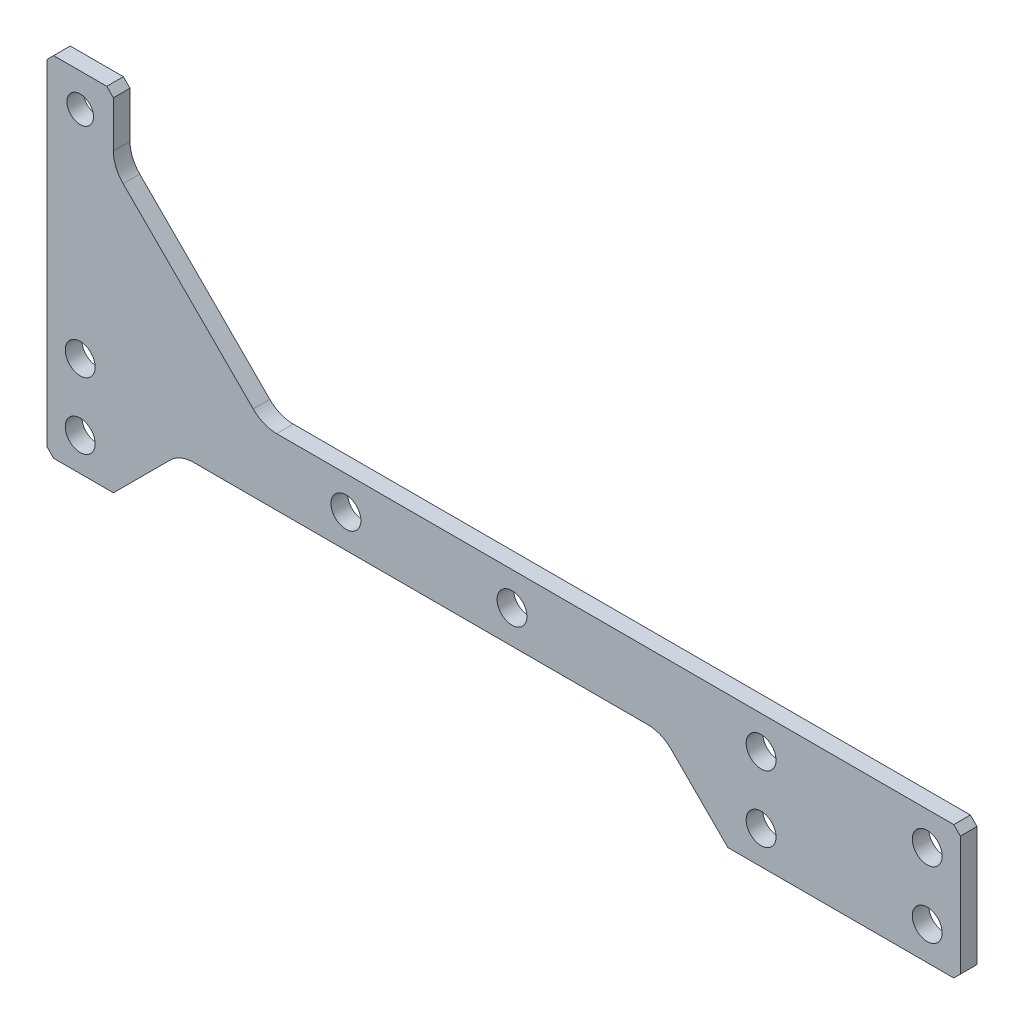
ISO-10303-21;
HEADER;
FILE_DESCRIPTION(('STEP AP214'),'2;1');
FILE_NAME('part.step','',(''),(''),'','','');
FILE_SCHEMA(('AUTOMOTIVE_DESIGN { 1 0 10303 214 1 1 1 1 }'));
ENDSEC;
DATA;
#1=APPLICATION_CONTEXT('core data for automotive mechanical design processes');
#2=APPLICATION_PROTOCOL_DEFINITION('international standard','automotive_design',2000,#1);
#3=PRODUCT_CONTEXT('',#1,'mechanical');
#4=PRODUCT('Part','Part','',(#3));
#5=PRODUCT_RELATED_PRODUCT_CATEGORY('part','',(#4));
#6=PRODUCT_DEFINITION_FORMATION('','',#4);
#7=PRODUCT_DEFINITION_CONTEXT('part definition',#1,'design');
#8=PRODUCT_DEFINITION('design','',#6,#7);
#9=PRODUCT_DEFINITION_SHAPE('','',#8);
#10=(LENGTH_UNIT() NAMED_UNIT(*) SI_UNIT(.MILLI.,.METRE.));
#11=(NAMED_UNIT(*) PLANE_ANGLE_UNIT() SI_UNIT($,.RADIAN.));
#12=(NAMED_UNIT(*) SI_UNIT($,.STERADIAN.) SOLID_ANGLE_UNIT());
#13=UNCERTAINTY_MEASURE_WITH_UNIT(LENGTH_MEASURE(1.E-05),#10,'distance_accuracy_value','');
#14=(GEOMETRIC_REPRESENTATION_CONTEXT(3) GLOBAL_UNCERTAINTY_ASSIGNED_CONTEXT((#13)) GLOBAL_UNIT_ASSIGNED_CONTEXT((#10,
#11,#12)) REPRESENTATION_CONTEXT('',''));
#15=CARTESIAN_POINT('',(0.,0.,0.));
#16=DIRECTION('',(0.,0.,1.));
#17=DIRECTION('',(1.,0.,0.));
#18=AXIS2_PLACEMENT_3D('',#15,#16,#17);
#19=CARTESIAN_POINT('',(0.,0.,5.));
#20=DIRECTION('',(0.,0.,-1.));
#21=DIRECTION('',(-1.,0.,0.));
#22=AXIS2_PLACEMENT_3D('',#19,#20,#21);
#23=PLANE('',#22);
#24=CARTESIAN_POINT('',(50.,20.,5.));
#25=DIRECTION('',(0.,0.,1.));
#26=DIRECTION('',(1.,0.,0.));
#27=AXIS2_PLACEMENT_3D('',#24,#25,#26);
#28=CIRCLE('',#27,4.5);
#29=CARTESIAN_POINT('',(54.5,20.,5.));
#30=VERTEX_POINT('',#29);
#31=EDGE_CURVE('E614',#30,#30,#28,.T.);
#32=ORIENTED_EDGE('',*,*,#31,.F.);
#33=EDGE_LOOP('',(#32));
#34=FACE_BOUND('',#33,.T.);
#35=CARTESIAN_POINT('',(-125.,19.986,5.));
#36=DIRECTION('',(0.,0.,1.));
#37=DIRECTION('',(1.,0.,0.));
#38=AXIS2_PLACEMENT_3D('',#35,#36,#37);
#39=CIRCLE('',#38,4.49999999999999);
#40=CARTESIAN_POINT('',(-120.5,19.986,5.));
#41=VERTEX_POINT('',#40);
#42=EDGE_CURVE('E603',#41,#41,#39,.T.);
#43=ORIENTED_EDGE('',*,*,#42,.F.);
#44=EDGE_LOOP('',(#43));
#45=FACE_BOUND('',#44,.T.);
#46=CARTESIAN_POINT('',(-74.9999999999999,19.986,5.));
#47=DIRECTION('',(0.,0.,1.));
#48=DIRECTION('',(1.,0.,0.));
#49=AXIS2_PLACEMENT_3D('',#46,#47,#48);
#50=CIRCLE('',#49,4.5);
#51=CARTESIAN_POINT('',(-70.4999999999999,19.986,5.));
#52=VERTEX_POINT('',#51);
#53=EDGE_CURVE('E604',#52,#52,#50,.T.);
#54=ORIENTED_EDGE('',*,*,#53,.F.);
#55=EDGE_LOOP('',(#54));
#56=FACE_BOUND('',#55,.T.);
#57=DIRECTION('',(1.,0.,0.));
#58=VECTOR('',#57,1.);
#59=CARTESIAN_POINT('',(-10.,-10.,5.));
#60=LINE('',#59,#58);
#61=CARTESIAN_POINT('',(-10.,-10.,5.));
#62=VERTEX_POINT('',#61);
#63=CARTESIAN_POINT('',(58.0000000000001,-10.,5.));
#64=VERTEX_POINT('',#63);
#65=EDGE_CURVE('E388',#62,#64,#60,.T.);
#66=ORIENTED_EDGE('',*,*,#65,.T.);
#67=DIRECTION('',(-0.707106781186548,-0.707106781186548,0.));
#68=VECTOR('',#67,1.);
#69=CARTESIAN_POINT('',(60.0000000000001,-7.99999999999997,5.));
#70=LINE('',#69,#68);
#71=CARTESIAN_POINT('',(60.0000000000001,-7.99999999999997,5.));
#72=VERTEX_POINT('',#71);
#73=EDGE_CURVE('E304',#64,#72,#70,.F.);
#74=ORIENTED_EDGE('',*,*,#73,.T.);
#75=DIRECTION('',(0.,1.,0.));
#76=VECTOR('',#75,1.);
#77=CARTESIAN_POINT('',(60.0000000000001,10.,5.));
#78=LINE('',#77,#76);
#79=CARTESIAN_POINT('',(60.0000000000001,28.,5.));
#80=VERTEX_POINT('',#79);
#81=EDGE_CURVE('E398',#72,#80,#78,.T.);
#82=ORIENTED_EDGE('',*,*,#81,.T.);
#83=DIRECTION('',(0.707106781186548,-0.707106781186548,0.));
#84=VECTOR('',#83,1.);
#85=CARTESIAN_POINT('',(58.0000000000001,30.,5.));
#86=LINE('',#85,#84);
#87=CARTESIAN_POINT('',(58.0000000000001,30.,5.));
#88=VERTEX_POINT('',#87);
#89=EDGE_CURVE('E59',#80,#88,#86,.F.);
#90=ORIENTED_EDGE('',*,*,#89,.T.);
#91=DIRECTION('',(-1.,0.,0.));
#92=VECTOR('',#91,1.);
#93=CARTESIAN_POINT('',(60.0000000000001,30.,5.));
#94=LINE('',#93,#92);
#95=CARTESIAN_POINT('',(-145.857864376269,30.,5.));
#96=VERTEX_POINT('',#95);
#97=EDGE_CURVE('E411',#88,#96,#94,.T.);
#98=ORIENTED_EDGE('',*,*,#97,.T.);
#99=CARTESIAN_POINT('',(-145.857864376269,40.,5.));
#100=DIRECTION('',(0.,0.,-1.));
#101=DIRECTION('',(-1.,0.,0.));
#102=AXIS2_PLACEMENT_3D('',#99,#100,#101);
#103=CIRCLE('',#102,10.);
#104=CARTESIAN_POINT('',(-152.928932188134,32.9289321881345,5.));
#105=VERTEX_POINT('',#104);
#106=EDGE_CURVE('E254',#96,#105,#103,.T.);
#107=ORIENTED_EDGE('',*,*,#106,.T.);
#108=DIRECTION('',(-0.707106781186547,0.707106781186548,0.));
#109=VECTOR('',#108,1.);
#110=CARTESIAN_POINT('',(-150.,30.,5.));
#111=LINE('',#110,#109);
#112=CARTESIAN_POINT('',(-192.071067811865,72.0710678118654,5.));
#113=VERTEX_POINT('',#112);
#114=EDGE_CURVE('E381',#105,#113,#111,.T.);
#115=ORIENTED_EDGE('',*,*,#114,.T.);
#116=CARTESIAN_POINT('',(-185.,79.1421356237309,5.));
#117=DIRECTION('',(0.,0.,-1.));
#118=DIRECTION('',(-1.,0.,0.));
#119=AXIS2_PLACEMENT_3D('',#116,#117,#118);
#120=CIRCLE('',#119,10.);
#121=CARTESIAN_POINT('',(-195.,79.1421356237309,5.));
#122=VERTEX_POINT('',#121);
#123=EDGE_CURVE('E247',#113,#122,#120,.T.);
#124=ORIENTED_EDGE('',*,*,#123,.T.);
#125=DIRECTION('',(0.,1.,0.));
#126=VECTOR('',#125,1.);
#127=CARTESIAN_POINT('',(-195.,95.,5.));
#128=LINE('',#127,#126);
#129=CARTESIAN_POINT('',(-195.,93.,5.));
#130=VERTEX_POINT('',#129);
#131=EDGE_CURVE('E378',#122,#130,#128,.T.);
#132=ORIENTED_EDGE('',*,*,#131,.T.);
#133=DIRECTION('',(0.707106781186548,-0.707106781186548,0.));
#134=VECTOR('',#133,1.);
#135=CARTESIAN_POINT('',(-197.,95.,5.));
#136=LINE('',#135,#134);
#137=CARTESIAN_POINT('',(-197.,95.,5.));
#138=VERTEX_POINT('',#137);
#139=EDGE_CURVE('E297',#130,#138,#136,.F.);
#140=ORIENTED_EDGE('',*,*,#139,.T.);
#141=DIRECTION('',(-1.,0.,0.));
#142=VECTOR('',#141,1.);
#143=CARTESIAN_POINT('',(-215.,95.,5.));
#144=LINE('',#143,#142);
#145=CARTESIAN_POINT('',(-213.,95.,5.));
#146=VERTEX_POINT('',#145);
#147=EDGE_CURVE('E335',#138,#146,#144,.T.);
#148=ORIENTED_EDGE('',*,*,#147,.T.);
#149=DIRECTION('',(0.707106781186557,0.707106781186538,0.));
#150=VECTOR('',#149,1.);
#151=CARTESIAN_POINT('',(-215.,93.,5.));
#152=LINE('',#151,#150);
#153=CARTESIAN_POINT('',(-215.,93.,5.));
#154=VERTEX_POINT('',#153);
#155=EDGE_CURVE('E294',#146,#154,#152,.F.);
#156=ORIENTED_EDGE('',*,*,#155,.T.);
#157=DIRECTION('',(0.,-1.,0.));
#158=VECTOR('',#157,1.);
#159=CARTESIAN_POINT('',(-215.,75.,5.));
#160=LINE('',#159,#158);
#161=CARTESIAN_POINT('',(-215.,-7.99999999999997,5.));
#162=VERTEX_POINT('',#161);
#163=EDGE_CURVE('E191',#154,#162,#160,.T.);
#164=ORIENTED_EDGE('',*,*,#163,.T.);
#165=DIRECTION('',(-0.707106781186548,0.707106781186548,0.));
#166=VECTOR('',#165,1.);
#167=CARTESIAN_POINT('',(-213.,-9.99999999999999,5.));
#168=LINE('',#167,#166);
#169=CARTESIAN_POINT('',(-213.,-9.99999999999999,5.));
#170=VERTEX_POINT('',#169);
#171=EDGE_CURVE('E66',#162,#170,#168,.F.);
#172=ORIENTED_EDGE('',*,*,#171,.T.);
#173=DIRECTION('',(1.,0.,0.));
#174=VECTOR('',#173,1.);
#175=CARTESIAN_POINT('',(-195.,-9.99999999999999,5.));
#176=LINE('',#175,#174);
#177=CARTESIAN_POINT('',(-195.,-9.99999999999999,5.));
#178=VERTEX_POINT('',#177);
#179=EDGE_CURVE('E179',#170,#178,#176,.T.);
#180=ORIENTED_EDGE('',*,*,#179,.T.);
#181=DIRECTION('',(-0.707106781186551,-0.707106781186544,0.));
#182=VECTOR('',#181,1.);
#183=CARTESIAN_POINT('',(-92.4999999999989,92.4999999999999,5.));
#184=LINE('',#183,#182);
#185=CARTESIAN_POINT('',(-177.928932188134,7.07106781186544,5.));
#186=VERTEX_POINT('',#185);
#187=EDGE_CURVE('E184',#178,#186,#184,.F.);
#188=ORIENTED_EDGE('',*,*,#187,.T.);
#189=CARTESIAN_POINT('',(-170.857864376269,0.,5.));
#190=DIRECTION('',(0.,0.,-1.));
#191=DIRECTION('',(-1.,0.,0.));
#192=AXIS2_PLACEMENT_3D('',#189,#190,#191);
#193=CIRCLE('',#192,10.);
#194=CARTESIAN_POINT('',(-170.857864376269,9.99999999999995,5.));
#195=VERTEX_POINT('',#194);
#196=EDGE_CURVE('E260',#186,#195,#193,.T.);
#197=ORIENTED_EDGE('',*,*,#196,.T.);
#198=DIRECTION('',(1.,0.,0.));
#199=VECTOR('',#198,1.);
#200=CARTESIAN_POINT('',(-9.99999999999989,9.99999999999996,5.));
#201=LINE('',#200,#199);
#202=CARTESIAN_POINT('',(-34.1421356237308,9.99999999999996,5.));
#203=VERTEX_POINT('',#202);
#204=EDGE_CURVE('E190',#195,#203,#201,.T.);
#205=ORIENTED_EDGE('',*,*,#204,.T.);
#206=CARTESIAN_POINT('',(-34.1421356237308,0.,5.));
#207=DIRECTION('',(0.,0.,-1.));
#208=DIRECTION('',(-1.,0.,0.));
#209=AXIS2_PLACEMENT_3D('',#206,#207,#208);
#210=CIRCLE('',#209,10.);
#211=CARTESIAN_POINT('',(-27.0710678118653,7.0710678118654,5.));
#212=VERTEX_POINT('',#211);
#213=EDGE_CURVE('E263',#203,#212,#210,.T.);
#214=ORIENTED_EDGE('',*,*,#213,.T.);
#215=DIRECTION('',(-0.707106781186545,0.70710678118655,0.));
#216=VECTOR('',#215,1.);
#217=CARTESIAN_POINT('',(-10.,-9.99999999999996,5.));
#218=LINE('',#217,#216);
#219=EDGE_CURVE('E217',#212,#62,#218,.F.);
#220=ORIENTED_EDGE('',*,*,#219,.T.);
#221=EDGE_LOOP('',(#66,#74,#82,#90,#98,#107,#115,#124,#132,#140,#148,#156,#164,#172,#180,#188,
#197,#205,#214,#220));
#222=FACE_BOUND('',#221,.T.);
#223=CARTESIAN_POINT('',(0.,0.,5.));
#224=DIRECTION('',(0.,0.,1.));
#225=DIRECTION('',(1.,0.,0.));
#226=AXIS2_PLACEMENT_3D('',#223,#224,#225);
#227=CIRCLE('',#226,4.5);
#228=CARTESIAN_POINT('',(4.5,0.,5.));
#229=VERTEX_POINT('',#228);
#230=EDGE_CURVE('E353',#229,#229,#227,.T.);
#231=ORIENTED_EDGE('',*,*,#230,.F.);
#232=EDGE_LOOP('',(#231));
#233=FACE_BOUND('',#232,.T.);
#234=CARTESIAN_POINT('',(50.,0.,5.));
#235=DIRECTION('',(0.,0.,1.));
#236=DIRECTION('',(1.,0.,0.));
#237=AXIS2_PLACEMENT_3D('',#234,#235,#236);
#238=CIRCLE('',#237,4.5);
#239=CARTESIAN_POINT('',(54.5,0.,5.));
#240=VERTEX_POINT('',#239);
#241=EDGE_CURVE('E555',#240,#240,#238,.T.);
#242=ORIENTED_EDGE('',*,*,#241,.F.);
#243=EDGE_LOOP('',(#242));
#244=FACE_BOUND('',#243,.T.);
#245=CARTESIAN_POINT('',(-205.,19.9999999999999,5.));
#246=DIRECTION('',(0.,0.,1.));
#247=DIRECTION('',(1.,0.,0.));
#248=AXIS2_PLACEMENT_3D('',#245,#246,#247);
#249=CIRCLE('',#248,4.49999999999999);
#250=CARTESIAN_POINT('',(-200.5,19.9999999999999,5.));
#251=VERTEX_POINT('',#250);
#252=EDGE_CURVE('E563',#251,#251,#249,.T.);
#253=ORIENTED_EDGE('',*,*,#252,.F.);
#254=EDGE_LOOP('',(#253));
#255=FACE_BOUND('',#254,.T.);
#256=CARTESIAN_POINT('',(0.,20.,5.));
#257=DIRECTION('',(0.,0.,1.));
#258=DIRECTION('',(1.,0.,0.));
#259=AXIS2_PLACEMENT_3D('',#256,#257,#258);
#260=CIRCLE('',#259,4.5);
#261=CARTESIAN_POINT('',(4.5,20.,5.));
#262=VERTEX_POINT('',#261);
#263=EDGE_CURVE('E571',#262,#262,#260,.T.);
#264=ORIENTED_EDGE('',*,*,#263,.F.);
#265=EDGE_LOOP('',(#264));
#266=FACE_BOUND('',#265,.T.);
#267=CARTESIAN_POINT('',(-205.,0.,5.));
#268=DIRECTION('',(0.,0.,1.));
#269=DIRECTION('',(1.,0.,0.));
#270=AXIS2_PLACEMENT_3D('',#267,#268,#269);
#271=CIRCLE('',#270,4.49999999999999);
#272=CARTESIAN_POINT('',(-200.5,0.,5.));
#273=VERTEX_POINT('',#272);
#274=EDGE_CURVE('E579',#273,#273,#271,.T.);
#275=ORIENTED_EDGE('',*,*,#274,.F.);
#276=EDGE_LOOP('',(#275));
#277=FACE_BOUND('',#276,.T.);
#278=CARTESIAN_POINT('',(-205.,85.,5.));
#279=DIRECTION('',(0.,0.,1.));
#280=DIRECTION('',(1.,0.,0.));
#281=AXIS2_PLACEMENT_3D('',#278,#279,#280);
#282=CIRCLE('',#281,4.00000000000002);
#283=CARTESIAN_POINT('',(-201.,85.,5.));
#284=VERTEX_POINT('',#283);
#285=EDGE_CURVE('E587',#284,#284,#282,.T.);
#286=ORIENTED_EDGE('',*,*,#285,.F.);
#287=EDGE_LOOP('',(#286));
#288=FACE_BOUND('',#287,.T.);
#289=ADVANCED_FACE('F41',(#34,#45,#56,#222,#233,#244,#255,#266,#277,#288),#23,.F.);
#290=CARTESIAN_POINT('',(0.,0.,0.));
#291=DIRECTION('',(0.,0.,-1.));
#292=DIRECTION('',(-1.,0.,0.));
#293=AXIS2_PLACEMENT_3D('',#290,#291,#292);
#294=PLANE('',#293);
#295=CARTESIAN_POINT('',(50.,20.,0.));
#296=DIRECTION('',(0.,0.,-1.));
#297=DIRECTION('',(-1.,0.,0.));
#298=AXIS2_PLACEMENT_3D('',#295,#296,#297);
#299=CIRCLE('',#298,4.5);
#300=CARTESIAN_POINT('',(45.5,20.,0.));
#301=VERTEX_POINT('',#300);
#302=EDGE_CURVE('E46',#301,#301,#299,.T.);
#303=ORIENTED_EDGE('',*,*,#302,.F.);
#304=EDGE_LOOP('',(#303));
#305=FACE_BOUND('',#304,.T.);
#306=CARTESIAN_POINT('',(-125.,19.986,0.));
#307=DIRECTION('',(0.,0.,-1.));
#308=DIRECTION('',(-1.,0.,0.));
#309=AXIS2_PLACEMENT_3D('',#306,#307,#308);
#310=CIRCLE('',#309,4.49999999999999);
#311=CARTESIAN_POINT('',(-129.5,19.986,0.));
#312=VERTEX_POINT('',#311);
#313=EDGE_CURVE('E595',#312,#312,#310,.F.);
#314=ORIENTED_EDGE('',*,*,#313,.T.);
#315=EDGE_LOOP('',(#314));
#316=FACE_BOUND('',#315,.T.);
#317=CARTESIAN_POINT('',(-74.9999999999999,19.986,0.));
#318=DIRECTION('',(0.,0.,-1.));
#319=DIRECTION('',(-1.,0.,0.));
#320=AXIS2_PLACEMENT_3D('',#317,#318,#319);
#321=CIRCLE('',#320,4.5);
#322=CARTESIAN_POINT('',(-79.4999999999999,19.986,0.));
#323=VERTEX_POINT('',#322);
#324=EDGE_CURVE('E599',#323,#323,#321,.F.);
#325=ORIENTED_EDGE('',*,*,#324,.T.);
#326=EDGE_LOOP('',(#325));
#327=FACE_BOUND('',#326,.T.);
#328=CARTESIAN_POINT('',(-205.,0.,0.));
#329=DIRECTION('',(0.,0.,1.));
#330=DIRECTION('',(1.,0.,0.));
#331=AXIS2_PLACEMENT_3D('',#328,#329,#330);
#332=CIRCLE('',#331,4.49999999999999);
#333=CARTESIAN_POINT('',(-200.5,0.,0.));
#334=VERTEX_POINT('',#333);
#335=EDGE_CURVE('E583',#334,#334,#332,.T.);
#336=ORIENTED_EDGE('',*,*,#335,.T.);
#337=EDGE_LOOP('',(#336));
#338=FACE_BOUND('',#337,.T.);
#339=CARTESIAN_POINT('',(-205.,19.9999999999999,0.));
#340=DIRECTION('',(0.,0.,1.));
#341=DIRECTION('',(1.,0.,0.));
#342=AXIS2_PLACEMENT_3D('',#339,#340,#341);
#343=CIRCLE('',#342,4.49999999999999);
#344=CARTESIAN_POINT('',(-200.5,19.9999999999999,0.));
#345=VERTEX_POINT('',#344);
#346=EDGE_CURVE('E567',#345,#345,#343,.T.);
#347=ORIENTED_EDGE('',*,*,#346,.T.);
#348=EDGE_LOOP('',(#347));
#349=FACE_BOUND('',#348,.T.);
#350=CARTESIAN_POINT('',(0.,0.,0.));
#351=DIRECTION('',(0.,0.,1.));
#352=DIRECTION('',(1.,0.,0.));
#353=AXIS2_PLACEMENT_3D('',#350,#351,#352);
#354=CIRCLE('',#353,4.5);
#355=CARTESIAN_POINT('',(4.5,0.,0.));
#356=VERTEX_POINT('',#355);
#357=EDGE_CURVE('E541',#356,#356,#354,.T.);
#358=ORIENTED_EDGE('',*,*,#357,.T.);
#359=EDGE_LOOP('',(#358));
#360=FACE_BOUND('',#359,.T.);
#361=DIRECTION('',(0.,1.,0.));
#362=VECTOR('',#361,1.);
#363=CARTESIAN_POINT('',(60.0000000000001,10.,0.));
#364=LINE('',#363,#362);
#365=CARTESIAN_POINT('',(60.0000000000001,-7.99999999999997,0.));
#366=VERTEX_POINT('',#365);
#367=CARTESIAN_POINT('',(60.0000000000001,28.,0.));
#368=VERTEX_POINT('',#367);
#369=EDGE_CURVE('E367',#366,#368,#364,.T.);
#370=ORIENTED_EDGE('',*,*,#369,.F.);
#371=DIRECTION('',(0.707106781186548,0.707106781186548,0.));
#372=VECTOR('',#371,1.);
#373=CARTESIAN_POINT('',(34.,-34.,0.));
#374=LINE('',#373,#372);
#375=CARTESIAN_POINT('',(58.0000000000001,-10.,0.));
#376=VERTEX_POINT('',#375);
#377=EDGE_CURVE('E288',#366,#376,#374,.F.);
#378=ORIENTED_EDGE('',*,*,#377,.T.);
#379=DIRECTION('',(1.,0.,0.));
#380=VECTOR('',#379,1.);
#381=CARTESIAN_POINT('',(40.0000000000001,-10.,0.));
#382=LINE('',#381,#380);
#383=CARTESIAN_POINT('',(-10.,-10.,0.));
#384=VERTEX_POINT('',#383);
#385=EDGE_CURVE('E363',#384,#376,#382,.T.);
#386=ORIENTED_EDGE('',*,*,#385,.F.);
#387=DIRECTION('',(0.707106781186545,-0.70710678118655,0.));
#388=VECTOR('',#387,1.);
#389=CARTESIAN_POINT('',(-10.,-10.,0.));
#390=LINE('',#389,#388);
#391=CARTESIAN_POINT('',(-27.0710678118653,7.0710678118654,0.));
#392=VERTEX_POINT('',#391);
#393=EDGE_CURVE('E202',#384,#392,#390,.F.);
#394=ORIENTED_EDGE('',*,*,#393,.T.);
#395=CARTESIAN_POINT('',(-34.1421356237308,0.,0.));
#396=DIRECTION('',(0.,0.,-1.));
#397=DIRECTION('',(-1.,0.,0.));
#398=AXIS2_PLACEMENT_3D('',#395,#396,#397);
#399=CIRCLE('',#398,10.);
#400=CARTESIAN_POINT('',(-34.1421356237308,9.99999999999996,0.));
#401=VERTEX_POINT('',#400);
#402=EDGE_CURVE('E266',#392,#401,#399,.F.);
#403=ORIENTED_EDGE('',*,*,#402,.T.);
#404=DIRECTION('',(1.,0.,0.));
#405=VECTOR('',#404,1.);
#406=CARTESIAN_POINT('',(-9.99999999999989,9.99999999999996,0.));
#407=LINE('',#406,#405);
#408=CARTESIAN_POINT('',(-170.857864376269,9.99999999999995,0.));
#409=VERTEX_POINT('',#408);
#410=EDGE_CURVE('E359',#409,#401,#407,.T.);
#411=ORIENTED_EDGE('',*,*,#410,.F.);
#412=CARTESIAN_POINT('',(-170.857864376269,0.,0.));
#413=DIRECTION('',(0.,0.,-1.));
#414=DIRECTION('',(-1.,0.,0.));
#415=AXIS2_PLACEMENT_3D('',#412,#413,#414);
#416=CIRCLE('',#415,10.);
#417=CARTESIAN_POINT('',(-177.928932188134,7.07106781186545,0.));
#418=VERTEX_POINT('',#417);
#419=EDGE_CURVE('E257',#409,#418,#416,.F.);
#420=ORIENTED_EDGE('',*,*,#419,.T.);
#421=DIRECTION('',(0.707106781186551,0.707106781186544,0.));
#422=VECTOR('',#421,1.);
#423=CARTESIAN_POINT('',(-175.,9.99999999999995,0.));
#424=LINE('',#423,#422);
#425=CARTESIAN_POINT('',(-195.,-9.99999999999999,0.));
#426=VERTEX_POINT('',#425);
#427=EDGE_CURVE('E210',#418,#426,#424,.F.);
#428=ORIENTED_EDGE('',*,*,#427,.T.);
#429=DIRECTION('',(1.,0.,0.));
#430=VECTOR('',#429,1.);
#431=CARTESIAN_POINT('',(-195.,-9.99999999999999,0.));
#432=LINE('',#431,#430);
#433=CARTESIAN_POINT('',(-213.,-9.99999999999999,0.));
#434=VERTEX_POINT('',#433);
#435=EDGE_CURVE('E197',#434,#426,#432,.T.);
#436=ORIENTED_EDGE('',*,*,#435,.F.);
#437=DIRECTION('',(0.707106781186548,-0.707106781186548,0.));
#438=VECTOR('',#437,1.);
#439=CARTESIAN_POINT('',(-111.5,-111.5,0.));
#440=LINE('',#439,#438);
#441=CARTESIAN_POINT('',(-215.,-7.99999999999997,0.));
#442=VERTEX_POINT('',#441);
#443=EDGE_CURVE('E282',#434,#442,#440,.F.);
#444=ORIENTED_EDGE('',*,*,#443,.T.);
#445=DIRECTION('',(0.,-1.,0.));
#446=VECTOR('',#445,1.);
#447=CARTESIAN_POINT('',(-215.,-9.99999999999999,0.));
#448=LINE('',#447,#446);
#449=CARTESIAN_POINT('',(-215.,93.,0.));
#450=VERTEX_POINT('',#449);
#451=EDGE_CURVE('E346',#450,#442,#448,.T.);
#452=ORIENTED_EDGE('',*,*,#451,.F.);
#453=DIRECTION('',(-0.707106781186557,-0.707106781186538,0.));
#454=VECTOR('',#453,1.);
#455=CARTESIAN_POINT('',(-153.999999999997,154.000000000001,0.));
#456=LINE('',#455,#454);
#457=CARTESIAN_POINT('',(-213.,95.,0.));
#458=VERTEX_POINT('',#457);
#459=EDGE_CURVE('E276',#450,#458,#456,.F.);
#460=ORIENTED_EDGE('',*,*,#459,.T.);
#461=DIRECTION('',(-1.,0.,0.));
#462=VECTOR('',#461,1.);
#463=CARTESIAN_POINT('',(-215.,95.,0.));
#464=LINE('',#463,#462);
#465=CARTESIAN_POINT('',(-197.,95.,0.));
#466=VERTEX_POINT('',#465);
#467=EDGE_CURVE('E332',#466,#458,#464,.T.);
#468=ORIENTED_EDGE('',*,*,#467,.F.);
#469=DIRECTION('',(-0.707106781186548,0.707106781186548,0.));
#470=VECTOR('',#469,1.);
#471=CARTESIAN_POINT('',(-50.9999999999999,-50.9999999999999,0.));
#472=LINE('',#471,#470);
#473=CARTESIAN_POINT('',(-195.,93.,0.));
#474=VERTEX_POINT('',#473);
#475=EDGE_CURVE('E279',#466,#474,#472,.F.);
#476=ORIENTED_EDGE('',*,*,#475,.T.);
#477=DIRECTION('',(0.,1.,0.));
#478=VECTOR('',#477,1.);
#479=CARTESIAN_POINT('',(-195.,95.,0.));
#480=LINE('',#479,#478);
#481=CARTESIAN_POINT('',(-195.,79.1421356237309,0.));
#482=VERTEX_POINT('',#481);
#483=EDGE_CURVE('E347',#482,#474,#480,.T.);
#484=ORIENTED_EDGE('',*,*,#483,.F.);
#485=CARTESIAN_POINT('',(-185.,79.1421356237309,0.));
#486=DIRECTION('',(0.,0.,-1.));
#487=DIRECTION('',(-1.,0.,0.));
#488=AXIS2_PLACEMENT_3D('',#485,#486,#487);
#489=CIRCLE('',#488,10.);
#490=CARTESIAN_POINT('',(-192.071067811865,72.0710678118654,0.));
#491=VERTEX_POINT('',#490);
#492=EDGE_CURVE('E244',#482,#491,#489,.F.);
#493=ORIENTED_EDGE('',*,*,#492,.T.);
#494=DIRECTION('',(-0.707106781186547,0.707106781186548,0.));
#495=VECTOR('',#494,1.);
#496=CARTESIAN_POINT('',(-150.,30.,0.));
#497=LINE('',#496,#495);
#498=CARTESIAN_POINT('',(-152.928932188134,32.9289321881345,0.));
#499=VERTEX_POINT('',#498);
#500=EDGE_CURVE('E374',#499,#491,#497,.T.);
#501=ORIENTED_EDGE('',*,*,#500,.F.);
#502=CARTESIAN_POINT('',(-145.857864376269,40.,0.));
#503=DIRECTION('',(0.,0.,-1.));
#504=DIRECTION('',(-1.,0.,0.));
#505=AXIS2_PLACEMENT_3D('',#502,#503,#504);
#506=CIRCLE('',#505,10.);
#507=CARTESIAN_POINT('',(-145.857864376269,30.,0.));
#508=VERTEX_POINT('',#507);
#509=EDGE_CURVE('E250',#499,#508,#506,.F.);
#510=ORIENTED_EDGE('',*,*,#509,.T.);
#511=DIRECTION('',(-1.,0.,0.));
#512=VECTOR('',#511,1.);
#513=CARTESIAN_POINT('',(60.0000000000001,30.,0.));
#514=LINE('',#513,#512);
#515=CARTESIAN_POINT('',(58.0000000000001,30.,0.));
#516=VERTEX_POINT('',#515);
#517=EDGE_CURVE('E371',#516,#508,#514,.T.);
#518=ORIENTED_EDGE('',*,*,#517,.F.);
#519=DIRECTION('',(-0.707106781186548,0.707106781186548,0.));
#520=VECTOR('',#519,1.);
#521=CARTESIAN_POINT('',(44.,44.,0.));
#522=LINE('',#521,#520);
#523=EDGE_CURVE('E285',#516,#368,#522,.F.);
#524=ORIENTED_EDGE('',*,*,#523,.T.);
#525=EDGE_LOOP('',(#370,#378,#386,#394,#403,#411,#420,#428,#436,#444,#452,#460,#468,#476,#484,
#493,#501,#510,#518,#524));
#526=FACE_BOUND('',#525,.T.);
#527=CARTESIAN_POINT('',(50.,0.,0.));
#528=DIRECTION('',(0.,0.,1.));
#529=DIRECTION('',(1.,0.,0.));
#530=AXIS2_PLACEMENT_3D('',#527,#528,#529);
#531=CIRCLE('',#530,4.5);
#532=CARTESIAN_POINT('',(54.5,0.,0.));
#533=VERTEX_POINT('',#532);
#534=EDGE_CURVE('E559',#533,#533,#531,.T.);
#535=ORIENTED_EDGE('',*,*,#534,.T.);
#536=EDGE_LOOP('',(#535));
#537=FACE_BOUND('',#536,.T.);
#538=CARTESIAN_POINT('',(0.,20.,0.));
#539=DIRECTION('',(0.,0.,1.));
#540=DIRECTION('',(1.,0.,0.));
#541=AXIS2_PLACEMENT_3D('',#538,#539,#540);
#542=CIRCLE('',#541,4.5);
#543=CARTESIAN_POINT('',(4.5,20.,0.));
#544=VERTEX_POINT('',#543);
#545=EDGE_CURVE('E575',#544,#544,#542,.T.);
#546=ORIENTED_EDGE('',*,*,#545,.T.);
#547=EDGE_LOOP('',(#546));
#548=FACE_BOUND('',#547,.T.);
#549=CARTESIAN_POINT('',(-205.,85.,0.));
#550=DIRECTION('',(0.,0.,1.));
#551=DIRECTION('',(1.,0.,0.));
#552=AXIS2_PLACEMENT_3D('',#549,#550,#551);
#553=CIRCLE('',#552,4.00000000000002);
#554=CARTESIAN_POINT('',(-201.,85.,0.));
#555=VERTEX_POINT('',#554);
#556=EDGE_CURVE('E591',#555,#555,#553,.T.);
#557=ORIENTED_EDGE('',*,*,#556,.T.);
#558=EDGE_LOOP('',(#557));
#559=FACE_BOUND('',#558,.T.);
#560=ADVANCED_FACE('F340',(#305,#316,#327,#338,#349,#360,#526,#537,#548,#559),#294,.T.);
#561=CARTESIAN_POINT('',(-195.,95.,5.));
#562=DIRECTION('',(-1.,0.,0.));
#563=DIRECTION('',(0.,0.,1.));
#564=AXIS2_PLACEMENT_3D('',#561,#562,#563);
#565=PLANE('',#564);
#566=ORIENTED_EDGE('',*,*,#483,.T.);
#567=DIRECTION('',(0.,0.,1.));
#568=VECTOR('',#567,1.);
#569=CARTESIAN_POINT('',(-195.,93.,5.));
#570=LINE('',#569,#568);
#571=EDGE_CURVE('E11',#474,#130,#570,.T.);
#572=ORIENTED_EDGE('',*,*,#571,.T.);
#573=ORIENTED_EDGE('',*,*,#131,.F.);
#574=DIRECTION('',(0.,0.,-1.));
#575=VECTOR('',#574,1.);
#576=CARTESIAN_POINT('',(-195.,79.1421356237309,0.));
#577=LINE('',#576,#575);
#578=EDGE_CURVE('E209',#122,#482,#577,.T.);
#579=ORIENTED_EDGE('',*,*,#578,.T.);
#580=EDGE_LOOP('',(#566,#572,#573,#579));
#581=FACE_BOUND('',#580,.T.);
#582=ADVANCED_FACE('F430',(#581),#565,.F.);
#583=CARTESIAN_POINT('',(-215.,95.,5.));
#584=DIRECTION('',(0.,-1.,0.));
#585=DIRECTION('',(0.,0.,-1.));
#586=AXIS2_PLACEMENT_3D('',#583,#584,#585);
#587=PLANE('',#586);
#588=ORIENTED_EDGE('',*,*,#147,.F.);
#589=DIRECTION('',(0.,0.,-1.));
#590=VECTOR('',#589,1.);
#591=CARTESIAN_POINT('',(-197.,95.,5.));
#592=LINE('',#591,#590);
#593=EDGE_CURVE('E52',#138,#466,#592,.T.);
#594=ORIENTED_EDGE('',*,*,#593,.T.);
#595=ORIENTED_EDGE('',*,*,#467,.T.);
#596=DIRECTION('',(0.,0.,1.));
#597=VECTOR('',#596,1.);
#598=CARTESIAN_POINT('',(-213.,95.,5.));
#599=LINE('',#598,#597);
#600=EDGE_CURVE('E321',#458,#146,#599,.T.);
#601=ORIENTED_EDGE('',*,*,#600,.T.);
#602=EDGE_LOOP('',(#588,#594,#595,#601));
#603=FACE_BOUND('',#602,.T.);
#604=ADVANCED_FACE('F331',(#603),#587,.F.);
#605=CARTESIAN_POINT('',(-215.,-9.99999999999999,5.));
#606=DIRECTION('',(1.,0.,0.));
#607=DIRECTION('',(0.,0.,-1.));
#608=AXIS2_PLACEMENT_3D('',#605,#606,#607);
#609=PLANE('',#608);
#610=ORIENTED_EDGE('',*,*,#451,.T.);
#611=DIRECTION('',(0.,0.,1.));
#612=VECTOR('',#611,1.);
#613=CARTESIAN_POINT('',(-215.,-7.99999999999997,5.));
#614=LINE('',#613,#612);
#615=EDGE_CURVE('E318',#442,#162,#614,.T.);
#616=ORIENTED_EDGE('',*,*,#615,.T.);
#617=ORIENTED_EDGE('',*,*,#163,.F.);
#618=DIRECTION('',(0.,0.,-1.));
#619=VECTOR('',#618,1.);
#620=CARTESIAN_POINT('',(-215.,93.,5.));
#621=LINE('',#620,#619);
#622=EDGE_CURVE('E314',#154,#450,#621,.T.);
#623=ORIENTED_EDGE('',*,*,#622,.T.);
#624=EDGE_LOOP('',(#610,#616,#617,#623));
#625=FACE_BOUND('',#624,.T.);
#626=ADVANCED_FACE('F485',(#625),#609,.F.);
#627=CARTESIAN_POINT('',(-195.,-9.99999999999999,5.));
#628=DIRECTION('',(0.,1.,0.));
#629=DIRECTION('',(0.,0.,1.));
#630=AXIS2_PLACEMENT_3D('',#627,#628,#629);
#631=PLANE('',#630);
#632=ORIENTED_EDGE('',*,*,#179,.F.);
#633=DIRECTION('',(0.,0.,-1.));
#634=VECTOR('',#633,1.);
#635=CARTESIAN_POINT('',(-213.,-9.99999999999999,5.));
#636=LINE('',#635,#634);
#637=EDGE_CURVE('E311',#170,#434,#636,.T.);
#638=ORIENTED_EDGE('',*,*,#637,.T.);
#639=ORIENTED_EDGE('',*,*,#435,.T.);
#640=DIRECTION('',(0.,0.,-1.));
#641=VECTOR('',#640,1.);
#642=CARTESIAN_POINT('',(-195.,-9.99999999999999,5.));
#643=LINE('',#642,#641);
#644=EDGE_CURVE('E194',#178,#426,#643,.T.);
#645=ORIENTED_EDGE('',*,*,#644,.F.);
#646=EDGE_LOOP('',(#632,#638,#639,#645));
#647=FACE_BOUND('',#646,.T.);
#648=ADVANCED_FACE('F195',(#647),#631,.F.);
#649=CARTESIAN_POINT('',(-9.99999999999989,9.99999999999996,5.));
#650=DIRECTION('',(0.,1.,0.));
#651=DIRECTION('',(-1.,0.,0.));
#652=AXIS2_PLACEMENT_3D('',#649,#650,#651);
#653=PLANE('',#652);
#654=ORIENTED_EDGE('',*,*,#204,.F.);
#655=DIRECTION('',(0.,0.,1.));
#656=VECTOR('',#655,1.);
#657=CARTESIAN_POINT('',(-170.857864376269,9.99999999999995,0.));
#658=LINE('',#657,#656);
#659=EDGE_CURVE('E235',#195,#409,#658,.F.);
#660=ORIENTED_EDGE('',*,*,#659,.T.);
#661=ORIENTED_EDGE('',*,*,#410,.T.);
#662=DIRECTION('',(0.,0.,-1.));
#663=VECTOR('',#662,1.);
#664=CARTESIAN_POINT('',(-34.1421356237308,9.99999999999996,5.));
#665=LINE('',#664,#663);
#666=EDGE_CURVE('E231',#401,#203,#665,.F.);
#667=ORIENTED_EDGE('',*,*,#666,.T.);
#668=EDGE_LOOP('',(#654,#660,#661,#667));
#669=FACE_BOUND('',#668,.T.);
#670=ADVANCED_FACE('F479',(#669),#653,.F.);
#671=CARTESIAN_POINT('',(40.0000000000001,-10.,5.));
#672=DIRECTION('',(0.,1.,0.));
#673=DIRECTION('',(0.,0.,1.));
#674=AXIS2_PLACEMENT_3D('',#671,#672,#673);
#675=PLANE('',#674);
#676=ORIENTED_EDGE('',*,*,#385,.T.);
#677=DIRECTION('',(0.,0.,1.));
#678=VECTOR('',#677,1.);
#679=CARTESIAN_POINT('',(58.0000000000001,-10.,5.));
#680=LINE('',#679,#678);
#681=EDGE_CURVE('E291',#376,#64,#680,.T.);
#682=ORIENTED_EDGE('',*,*,#681,.T.);
#683=ORIENTED_EDGE('',*,*,#65,.F.);
#684=DIRECTION('',(0.,0.,-1.));
#685=VECTOR('',#684,1.);
#686=CARTESIAN_POINT('',(-10.,-10.,5.));
#687=LINE('',#686,#685);
#688=EDGE_CURVE('E203',#62,#384,#687,.T.);
#689=ORIENTED_EDGE('',*,*,#688,.T.);
#690=EDGE_LOOP('',(#676,#682,#683,#689));
#691=FACE_BOUND('',#690,.T.);
#692=ADVANCED_FACE('F395',(#691),#675,.F.);
#693=CARTESIAN_POINT('',(60.0000000000001,10.,5.));
#694=DIRECTION('',(-1.,0.,0.));
#695=DIRECTION('',(0.,-1.,0.));
#696=AXIS2_PLACEMENT_3D('',#693,#694,#695);
#697=PLANE('',#696);
#698=ORIENTED_EDGE('',*,*,#81,.F.);
#699=DIRECTION('',(0.,0.,-1.));
#700=VECTOR('',#699,1.);
#701=CARTESIAN_POINT('',(60.0000000000001,-7.99999999999997,5.));
#702=LINE('',#701,#700);
#703=EDGE_CURVE('E272',#72,#366,#702,.T.);
#704=ORIENTED_EDGE('',*,*,#703,.T.);
#705=ORIENTED_EDGE('',*,*,#369,.T.);
#706=DIRECTION('',(0.,0.,1.));
#707=VECTOR('',#706,1.);
#708=CARTESIAN_POINT('',(60.0000000000001,28.,5.));
#709=LINE('',#708,#707);
#710=EDGE_CURVE('E269',#368,#80,#709,.T.);
#711=ORIENTED_EDGE('',*,*,#710,.T.);
#712=EDGE_LOOP('',(#698,#704,#705,#711));
#713=FACE_BOUND('',#712,.T.);
#714=ADVANCED_FACE('F408',(#713),#697,.F.);
#715=CARTESIAN_POINT('',(60.0000000000001,30.,5.));
#716=DIRECTION('',(0.,-1.,0.));
#717=DIRECTION('',(1.,0.,0.));
#718=AXIS2_PLACEMENT_3D('',#715,#716,#717);
#719=PLANE('',#718);
#720=ORIENTED_EDGE('',*,*,#97,.F.);
#721=DIRECTION('',(0.,0.,-1.));
#722=VECTOR('',#721,1.);
#723=CARTESIAN_POINT('',(58.0000000000001,30.,5.));
#724=LINE('',#723,#722);
#725=EDGE_CURVE('E307',#88,#516,#724,.T.);
#726=ORIENTED_EDGE('',*,*,#725,.T.);
#727=ORIENTED_EDGE('',*,*,#517,.T.);
#728=DIRECTION('',(0.,0.,-1.));
#729=VECTOR('',#728,1.);
#730=CARTESIAN_POINT('',(-145.857864376269,30.,5.));
#731=LINE('',#730,#729);
#732=EDGE_CURVE('E227',#508,#96,#731,.F.);
#733=ORIENTED_EDGE('',*,*,#732,.T.);
#734=EDGE_LOOP('',(#720,#726,#727,#733));
#735=FACE_BOUND('',#734,.T.);
#736=ADVANCED_FACE('F439',(#735),#719,.F.);
#737=CARTESIAN_POINT('',(-150.,30.,5.));
#738=DIRECTION('',(-0.707106781186548,-0.707106781186547,0.));
#739=DIRECTION('',(0.707106781186547,-0.707106781186548,0.));
#740=AXIS2_PLACEMENT_3D('',#737,#738,#739);
#741=PLANE('',#740);
#742=ORIENTED_EDGE('',*,*,#500,.T.);
#743=DIRECTION('',(0.,0.,-1.));
#744=VECTOR('',#743,1.);
#745=CARTESIAN_POINT('',(-192.071067811865,72.0710678118654,5.));
#746=LINE('',#745,#744);
#747=EDGE_CURVE('E224',#491,#113,#746,.F.);
#748=ORIENTED_EDGE('',*,*,#747,.T.);
#749=ORIENTED_EDGE('',*,*,#114,.F.);
#750=DIRECTION('',(0.,0.,-1.));
#751=VECTOR('',#750,1.);
#752=CARTESIAN_POINT('',(-152.928932188134,32.9289321881345,0.));
#753=LINE('',#752,#751);
#754=EDGE_CURVE('E215',#105,#499,#753,.T.);
#755=ORIENTED_EDGE('',*,*,#754,.T.);
#756=EDGE_LOOP('',(#742,#748,#749,#755));
#757=FACE_BOUND('',#756,.T.);
#758=ADVANCED_FACE('F433',(#757),#741,.F.);
#759=CARTESIAN_POINT('',(0.,0.,5.));
#760=DIRECTION('',(0.,0.,-1.));
#761=DIRECTION('',(-1.,0.,0.));
#762=AXIS2_PLACEMENT_3D('',#759,#760,#761);
#763=CYLINDRICAL_SURFACE('',#762,4.5);
#764=ORIENTED_EDGE('',*,*,#230,.T.);
#765=EDGE_LOOP('',(#764));
#766=FACE_BOUND('',#765,.T.);
#767=ORIENTED_EDGE('',*,*,#357,.F.);
#768=EDGE_LOOP('',(#767));
#769=FACE_BOUND('',#768,.T.);
#770=ADVANCED_FACE('F468',(#766,#769),#763,.F.);
#771=CARTESIAN_POINT('',(50.,0.,5.));
#772=DIRECTION('',(0.,0.,-1.));
#773=DIRECTION('',(-1.,0.,0.));
#774=AXIS2_PLACEMENT_3D('',#771,#772,#773);
#775=CYLINDRICAL_SURFACE('',#774,4.5);
#776=ORIENTED_EDGE('',*,*,#241,.T.);
#777=EDGE_LOOP('',(#776));
#778=FACE_BOUND('',#777,.T.);
#779=ORIENTED_EDGE('',*,*,#534,.F.);
#780=EDGE_LOOP('',(#779));
#781=FACE_BOUND('',#780,.T.);
#782=ADVANCED_FACE('F634',(#778,#781),#775,.F.);
#783=CARTESIAN_POINT('',(-205.,19.9999999999999,5.));
#784=DIRECTION('',(0.,0.,-1.));
#785=DIRECTION('',(-1.,0.,0.));
#786=AXIS2_PLACEMENT_3D('',#783,#784,#785);
#787=CYLINDRICAL_SURFACE('',#786,4.49999999999999);
#788=ORIENTED_EDGE('',*,*,#252,.T.);
#789=EDGE_LOOP('',(#788));
#790=FACE_BOUND('',#789,.T.);
#791=ORIENTED_EDGE('',*,*,#346,.F.);
#792=EDGE_LOOP('',(#791));
#793=FACE_BOUND('',#792,.T.);
#794=ADVANCED_FACE('F640',(#790,#793),#787,.F.);
#795=CARTESIAN_POINT('',(0.,20.,5.));
#796=DIRECTION('',(0.,0.,-1.));
#797=DIRECTION('',(-1.,0.,0.));
#798=AXIS2_PLACEMENT_3D('',#795,#796,#797);
#799=CYLINDRICAL_SURFACE('',#798,4.5);
#800=ORIENTED_EDGE('',*,*,#263,.T.);
#801=EDGE_LOOP('',(#800));
#802=FACE_BOUND('',#801,.T.);
#803=ORIENTED_EDGE('',*,*,#545,.F.);
#804=EDGE_LOOP('',(#803));
#805=FACE_BOUND('',#804,.T.);
#806=ADVANCED_FACE('F664',(#802,#805),#799,.F.);
#807=CARTESIAN_POINT('',(-205.,0.,5.));
#808=DIRECTION('',(0.,0.,-1.));
#809=DIRECTION('',(-1.,0.,0.));
#810=AXIS2_PLACEMENT_3D('',#807,#808,#809);
#811=CYLINDRICAL_SURFACE('',#810,4.49999999999999);
#812=ORIENTED_EDGE('',*,*,#274,.T.);
#813=EDGE_LOOP('',(#812));
#814=FACE_BOUND('',#813,.T.);
#815=ORIENTED_EDGE('',*,*,#335,.F.);
#816=EDGE_LOOP('',(#815));
#817=FACE_BOUND('',#816,.T.);
#818=ADVANCED_FACE('F656',(#814,#817),#811,.F.);
#819=CARTESIAN_POINT('',(-205.,85.,5.));
#820=DIRECTION('',(0.,0.,-1.));
#821=DIRECTION('',(-1.,0.,0.));
#822=AXIS2_PLACEMENT_3D('',#819,#820,#821);
#823=CYLINDRICAL_SURFACE('',#822,4.00000000000002);
#824=ORIENTED_EDGE('',*,*,#285,.T.);
#825=EDGE_LOOP('',(#824));
#826=FACE_BOUND('',#825,.T.);
#827=ORIENTED_EDGE('',*,*,#556,.F.);
#828=EDGE_LOOP('',(#827));
#829=FACE_BOUND('',#828,.T.);
#830=ADVANCED_FACE('F499',(#826,#829),#823,.F.);
#831=CARTESIAN_POINT('',(-10.,-10.,5.));
#832=DIRECTION('',(-0.70710678118655,-0.707106781186545,0.));
#833=DIRECTION('',(0.,0.,1.));
#834=AXIS2_PLACEMENT_3D('',#831,#832,#833);
#835=PLANE('',#834);
#836=ORIENTED_EDGE('',*,*,#219,.F.);
#837=DIRECTION('',(0.,0.,1.));
#838=VECTOR('',#837,1.);
#839=CARTESIAN_POINT('',(-27.0710678118653,7.0710678118654,0.));
#840=LINE('',#839,#838);
#841=EDGE_CURVE('E241',#212,#392,#840,.F.);
#842=ORIENTED_EDGE('',*,*,#841,.T.);
#843=ORIENTED_EDGE('',*,*,#393,.F.);
#844=ORIENTED_EDGE('',*,*,#688,.F.);
#845=EDGE_LOOP('',(#836,#842,#843,#844));
#846=FACE_BOUND('',#845,.T.);
#847=ADVANCED_FACE('F400',(#846),#835,.T.);
#848=CARTESIAN_POINT('',(-175.,9.99999999999995,5.));
#849=DIRECTION('',(0.707106781186544,-0.707106781186551,0.));
#850=DIRECTION('',(0.,0.,1.));
#851=AXIS2_PLACEMENT_3D('',#848,#849,#850);
#852=PLANE('',#851);
#853=ORIENTED_EDGE('',*,*,#427,.F.);
#854=DIRECTION('',(0.,0.,-1.));
#855=VECTOR('',#854,1.);
#856=CARTESIAN_POINT('',(-177.928932188134,7.07106781186546,5.));
#857=LINE('',#856,#855);
#858=EDGE_CURVE('E207',#418,#186,#857,.F.);
#859=ORIENTED_EDGE('',*,*,#858,.T.);
#860=ORIENTED_EDGE('',*,*,#187,.F.);
#861=ORIENTED_EDGE('',*,*,#644,.T.);
#862=EDGE_LOOP('',(#853,#859,#860,#861));
#863=FACE_BOUND('',#862,.T.);
#864=ADVANCED_FACE('F205',(#863),#852,.T.);
#865=CARTESIAN_POINT('',(-74.9999999999999,19.986,-12.7279220613579));
#866=DIRECTION('',(0.,0.,1.));
#867=DIRECTION('',(1.,0.,0.));
#868=AXIS2_PLACEMENT_3D('',#865,#866,#867);
#869=CYLINDRICAL_SURFACE('',#868,4.5);
#870=ORIENTED_EDGE('',*,*,#53,.T.);
#871=EDGE_LOOP('',(#870));
#872=FACE_BOUND('',#871,.T.);
#873=ORIENTED_EDGE('',*,*,#324,.F.);
#874=EDGE_LOOP('',(#873));
#875=FACE_BOUND('',#874,.T.);
#876=ADVANCED_FACE('F505',(#872,#875),#869,.F.);
#877=CARTESIAN_POINT('',(-125.,19.986,-12.7279220613579));
#878=DIRECTION('',(0.,0.,1.));
#879=DIRECTION('',(1.,0.,0.));
#880=AXIS2_PLACEMENT_3D('',#877,#878,#879);
#881=CYLINDRICAL_SURFACE('',#880,4.49999999999999);
#882=ORIENTED_EDGE('',*,*,#42,.T.);
#883=EDGE_LOOP('',(#882));
#884=FACE_BOUND('',#883,.T.);
#885=ORIENTED_EDGE('',*,*,#313,.F.);
#886=EDGE_LOOP('',(#885));
#887=FACE_BOUND('',#886,.T.);
#888=ADVANCED_FACE('F508',(#884,#887),#881,.F.);
#889=CARTESIAN_POINT('',(-185.,79.1421356237309,5.));
#890=DIRECTION('',(0.,0.,1.));
#891=DIRECTION('',(1.,0.,0.));
#892=AXIS2_PLACEMENT_3D('',#889,#890,#891);
#893=CYLINDRICAL_SURFACE('',#892,10.);
#894=ORIENTED_EDGE('',*,*,#123,.F.);
#895=ORIENTED_EDGE('',*,*,#747,.F.);
#896=ORIENTED_EDGE('',*,*,#492,.F.);
#897=ORIENTED_EDGE('',*,*,#578,.F.);
#898=EDGE_LOOP('',(#894,#895,#896,#897));
#899=FACE_BOUND('',#898,.T.);
#900=ADVANCED_FACE('F428',(#899),#893,.F.);
#901=CARTESIAN_POINT('',(-145.857864376269,40.,5.));
#902=DIRECTION('',(0.,0.,1.));
#903=DIRECTION('',(1.,0.,0.));
#904=AXIS2_PLACEMENT_3D('',#901,#902,#903);
#905=CYLINDRICAL_SURFACE('',#904,10.);
#906=ORIENTED_EDGE('',*,*,#106,.F.);
#907=ORIENTED_EDGE('',*,*,#732,.F.);
#908=ORIENTED_EDGE('',*,*,#509,.F.);
#909=ORIENTED_EDGE('',*,*,#754,.F.);
#910=EDGE_LOOP('',(#906,#907,#908,#909));
#911=FACE_BOUND('',#910,.T.);
#912=ADVANCED_FACE('F435',(#911),#905,.F.);
#913=CARTESIAN_POINT('',(-170.857864376269,0.,5.));
#914=DIRECTION('',(0.,0.,-1.));
#915=DIRECTION('',(-1.,0.,0.));
#916=AXIS2_PLACEMENT_3D('',#913,#914,#915);
#917=CYLINDRICAL_SURFACE('',#916,10.);
#918=ORIENTED_EDGE('',*,*,#196,.F.);
#919=ORIENTED_EDGE('',*,*,#858,.F.);
#920=ORIENTED_EDGE('',*,*,#419,.F.);
#921=ORIENTED_EDGE('',*,*,#659,.F.);
#922=EDGE_LOOP('',(#918,#919,#920,#921));
#923=FACE_BOUND('',#922,.T.);
#924=ADVANCED_FACE('F511',(#923),#917,.F.);
#925=CARTESIAN_POINT('',(-34.1421356237308,0.,5.));
#926=DIRECTION('',(0.,0.,1.));
#927=DIRECTION('',(1.,0.,0.));
#928=AXIS2_PLACEMENT_3D('',#925,#926,#927);
#929=CYLINDRICAL_SURFACE('',#928,10.);
#930=ORIENTED_EDGE('',*,*,#402,.F.);
#931=ORIENTED_EDGE('',*,*,#841,.F.);
#932=ORIENTED_EDGE('',*,*,#213,.F.);
#933=ORIENTED_EDGE('',*,*,#666,.F.);
#934=EDGE_LOOP('',(#930,#931,#932,#933));
#935=FACE_BOUND('',#934,.T.);
#936=ADVANCED_FACE('F453',(#935),#929,.F.);
#937=CARTESIAN_POINT('',(60.0000000000001,-7.99999999999997,5.));
#938=DIRECTION('',(-0.707106781186547,0.707106781186547,0.));
#939=DIRECTION('',(0.,0.,-1.));
#940=AXIS2_PLACEMENT_3D('',#937,#938,#939);
#941=PLANE('',#940);
#942=ORIENTED_EDGE('',*,*,#73,.F.);
#943=ORIENTED_EDGE('',*,*,#681,.F.);
#944=ORIENTED_EDGE('',*,*,#377,.F.);
#945=ORIENTED_EDGE('',*,*,#703,.F.);
#946=EDGE_LOOP('',(#942,#943,#944,#945));
#947=FACE_BOUND('',#946,.T.);
#948=ADVANCED_FACE('F404',(#947),#941,.F.);
#949=CARTESIAN_POINT('',(58.0000000000001,30.,5.));
#950=DIRECTION('',(-0.707106781186547,-0.707106781186547,0.));
#951=DIRECTION('',(0.,0.,-1.));
#952=AXIS2_PLACEMENT_3D('',#949,#950,#951);
#953=PLANE('',#952);
#954=ORIENTED_EDGE('',*,*,#89,.F.);
#955=ORIENTED_EDGE('',*,*,#710,.F.);
#956=ORIENTED_EDGE('',*,*,#523,.F.);
#957=ORIENTED_EDGE('',*,*,#725,.F.);
#958=EDGE_LOOP('',(#954,#955,#956,#957));
#959=FACE_BOUND('',#958,.T.);
#960=ADVANCED_FACE('F442',(#959),#953,.F.);
#961=CARTESIAN_POINT('',(-213.,-9.99999999999999,5.));
#962=DIRECTION('',(0.707106781186547,0.707106781186547,0.));
#963=DIRECTION('',(0.,0.,-1.));
#964=AXIS2_PLACEMENT_3D('',#961,#962,#963);
#965=PLANE('',#964);
#966=ORIENTED_EDGE('',*,*,#171,.F.);
#967=ORIENTED_EDGE('',*,*,#615,.F.);
#968=ORIENTED_EDGE('',*,*,#443,.F.);
#969=ORIENTED_EDGE('',*,*,#637,.F.);
#970=EDGE_LOOP('',(#966,#967,#968,#969));
#971=FACE_BOUND('',#970,.T.);
#972=ADVANCED_FACE('F444',(#971),#965,.F.);
#973=CARTESIAN_POINT('',(-197.,95.,5.));
#974=DIRECTION('',(-0.707106781186547,-0.707106781186547,0.));
#975=DIRECTION('',(0.,0.,-1.));
#976=AXIS2_PLACEMENT_3D('',#973,#974,#975);
#977=PLANE('',#976);
#978=ORIENTED_EDGE('',*,*,#139,.F.);
#979=ORIENTED_EDGE('',*,*,#571,.F.);
#980=ORIENTED_EDGE('',*,*,#475,.F.);
#981=ORIENTED_EDGE('',*,*,#593,.F.);
#982=EDGE_LOOP('',(#978,#979,#980,#981));
#983=FACE_BOUND('',#982,.T.);
#984=ADVANCED_FACE('F450',(#983),#977,.F.);
#985=CARTESIAN_POINT('',(-215.,93.,5.));
#986=DIRECTION('',(0.707106781186538,-0.707106781186557,0.));
#987=DIRECTION('',(0.,0.,-1.));
#988=AXIS2_PLACEMENT_3D('',#985,#986,#987);
#989=PLANE('',#988);
#990=ORIENTED_EDGE('',*,*,#155,.F.);
#991=ORIENTED_EDGE('',*,*,#600,.F.);
#992=ORIENTED_EDGE('',*,*,#459,.F.);
#993=ORIENTED_EDGE('',*,*,#622,.F.);
#994=EDGE_LOOP('',(#990,#991,#992,#993));
#995=FACE_BOUND('',#994,.T.);
#996=ADVANCED_FACE('F44',(#995),#989,.F.);
#997=CARTESIAN_POINT('',(50.,20.,-5.));
#998=DIRECTION('',(0.,0.,1.));
#999=DIRECTION('',(1.,0.,0.));
#1000=AXIS2_PLACEMENT_3D('',#997,#998,#999);
#1001=CYLINDRICAL_SURFACE('',#1000,4.5);
#1002=ORIENTED_EDGE('',*,*,#302,.T.);
#1003=EDGE_LOOP('',(#1002));
#1004=FACE_BOUND('',#1003,.T.);
#1005=ORIENTED_EDGE('',*,*,#31,.T.);
#1006=EDGE_LOOP('',(#1005));
#1007=FACE_BOUND('',#1006,.T.);
#1008=ADVANCED_FACE('F533',(#1004,#1007),#1001,.F.);
#1009=CLOSED_SHELL('',(#289,#560,#582,#604,#626,#648,#670,#692,#714,#736,#758,#770,#782,#794,
#806,#818,#830,#847,#864,#876,#888,#900,#912,#924,#936,#948,#960,#972,#984,#996,#1008));
#1010=MANIFOLD_SOLID_BREP('B2',#1009);
#1011=ADVANCED_BREP_SHAPE_REPRESENTATION('',(#18,#1010),#14);
#1012=SHAPE_DEFINITION_REPRESENTATION(#9,#1011);
ENDSEC;
END-ISO-10303-21;
